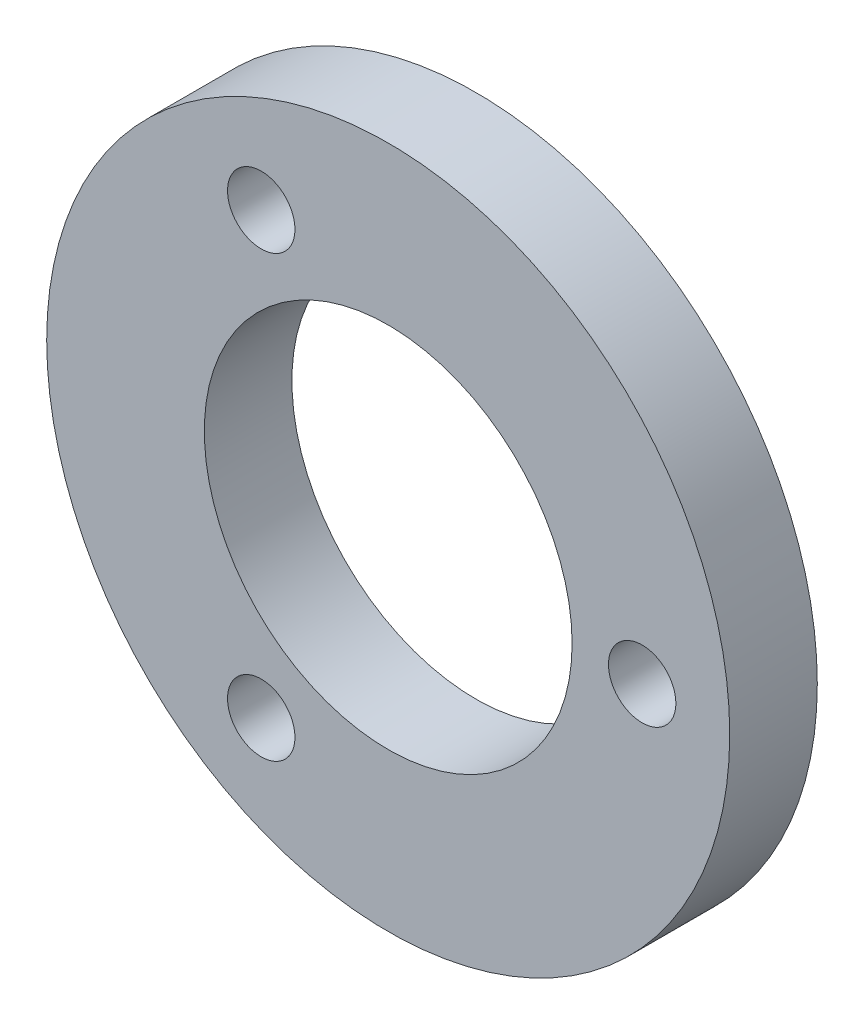
ISO-10303-21;
HEADER;
FILE_DESCRIPTION(('STEP AP214'),'2;1');
FILE_NAME('part.step','',(''),(''),'','','');
FILE_SCHEMA(('AUTOMOTIVE_DESIGN { 1 0 10303 214 1 1 1 1 }'));
ENDSEC;
DATA;
#1=APPLICATION_CONTEXT('core data for automotive mechanical design processes');
#2=APPLICATION_PROTOCOL_DEFINITION('international standard','automotive_design',2000,#1);
#3=PRODUCT_CONTEXT('',#1,'mechanical');
#4=PRODUCT('Part','Part','',(#3));
#5=PRODUCT_RELATED_PRODUCT_CATEGORY('part','',(#4));
#6=PRODUCT_DEFINITION_FORMATION('','',#4);
#7=PRODUCT_DEFINITION_CONTEXT('part definition',#1,'design');
#8=PRODUCT_DEFINITION('design','',#6,#7);
#9=PRODUCT_DEFINITION_SHAPE('','',#8);
#10=(LENGTH_UNIT() NAMED_UNIT(*) SI_UNIT(.MILLI.,.METRE.));
#11=(NAMED_UNIT(*) PLANE_ANGLE_UNIT() SI_UNIT($,.RADIAN.));
#12=(NAMED_UNIT(*) SI_UNIT($,.STERADIAN.) SOLID_ANGLE_UNIT());
#13=UNCERTAINTY_MEASURE_WITH_UNIT(LENGTH_MEASURE(1.E-05),#10,'distance_accuracy_value','');
#14=(GEOMETRIC_REPRESENTATION_CONTEXT(3) GLOBAL_UNCERTAINTY_ASSIGNED_CONTEXT((#13)) GLOBAL_UNIT_ASSIGNED_CONTEXT((#10,
#11,#12)) REPRESENTATION_CONTEXT('',''));
#15=CARTESIAN_POINT('',(0.,0.,0.));
#16=DIRECTION('',(0.,0.,1.));
#17=DIRECTION('',(1.,0.,0.));
#18=AXIS2_PLACEMENT_3D('',#15,#16,#17);
#19=CARTESIAN_POINT('',(0.,0.,5.));
#20=DIRECTION('',(0.,0.,1.));
#21=DIRECTION('',(1.,0.,0.));
#22=AXIS2_PLACEMENT_3D('',#19,#20,#21);
#23=PLANE('',#22);
#24=CARTESIAN_POINT('',(-7.25000000000023,-12.5573683548742,5.));
#25=DIRECTION('',(0.,0.,1.));
#26=DIRECTION('',(1.,0.,0.));
#27=AXIS2_PLACEMENT_3D('',#24,#25,#26);
#28=CIRCLE('',#27,1.92500000000001);
#29=CARTESIAN_POINT('',(-5.32500000000022,-12.5573683548742,5.));
#30=VERTEX_POINT('',#29);
#31=EDGE_CURVE('E52',#30,#30,#28,.T.);
#32=ORIENTED_EDGE('',*,*,#31,.F.);
#33=EDGE_LOOP('',(#32));
#34=FACE_BOUND('',#33,.T.);
#35=CARTESIAN_POINT('',(0.,0.,5.));
#36=DIRECTION('',(0.,0.,1.));
#37=DIRECTION('',(1.,0.,0.));
#38=AXIS2_PLACEMENT_3D('',#35,#36,#37);
#39=CIRCLE('',#38,10.5);
#40=CARTESIAN_POINT('',(10.5,0.,5.));
#41=VERTEX_POINT('',#40);
#42=EDGE_CURVE('E41',#41,#41,#39,.T.);
#43=ORIENTED_EDGE('',*,*,#42,.F.);
#44=EDGE_LOOP('',(#43));
#45=FACE_BOUND('',#44,.T.);
#46=CARTESIAN_POINT('',(0.,0.,5.));
#47=DIRECTION('',(0.,0.,1.));
#48=DIRECTION('',(1.,0.,0.));
#49=AXIS2_PLACEMENT_3D('',#46,#47,#48);
#50=CIRCLE('',#49,19.5);
#51=CARTESIAN_POINT('',(19.5,0.,5.));
#52=VERTEX_POINT('',#51);
#53=EDGE_CURVE('E10',#52,#52,#50,.T.);
#54=ORIENTED_EDGE('',*,*,#53,.T.);
#55=EDGE_LOOP('',(#54));
#56=FACE_BOUND('',#55,.T.);
#57=CARTESIAN_POINT('',(14.5,-2.22044604925031E-13,5.));
#58=DIRECTION('',(0.,0.,1.));
#59=DIRECTION('',(1.,0.,0.));
#60=AXIS2_PLACEMENT_3D('',#57,#58,#59);
#61=CIRCLE('',#60,1.92500000000001);
#62=CARTESIAN_POINT('',(16.425,-2.22044604925031E-13,5.));
#63=VERTEX_POINT('',#62);
#64=EDGE_CURVE('E46',#63,#63,#61,.T.);
#65=ORIENTED_EDGE('',*,*,#64,.F.);
#66=EDGE_LOOP('',(#65));
#67=FACE_BOUND('',#66,.T.);
#68=CARTESIAN_POINT('',(-7.24999999999999,12.5573683548743,5.));
#69=DIRECTION('',(0.,0.,1.));
#70=DIRECTION('',(1.,0.,0.));
#71=AXIS2_PLACEMENT_3D('',#68,#69,#70);
#72=CIRCLE('',#71,1.92500000000001);
#73=CARTESIAN_POINT('',(-5.32499999999998,12.5573683548743,5.));
#74=VERTEX_POINT('',#73);
#75=EDGE_CURVE('E58',#74,#74,#72,.T.);
#76=ORIENTED_EDGE('',*,*,#75,.F.);
#77=EDGE_LOOP('',(#76));
#78=FACE_BOUND('',#77,.T.);
#79=ADVANCED_FACE('F30',(#34,#45,#56,#67,#78),#23,.T.);
#80=CARTESIAN_POINT('',(0.,0.,0.));
#81=DIRECTION('',(0.,0.,1.));
#82=DIRECTION('',(1.,0.,0.));
#83=AXIS2_PLACEMENT_3D('',#80,#81,#82);
#84=PLANE('',#83);
#85=CARTESIAN_POINT('',(0.,0.,0.));
#86=DIRECTION('',(0.,0.,1.));
#87=DIRECTION('',(1.,0.,0.));
#88=AXIS2_PLACEMENT_3D('',#85,#86,#87);
#89=CIRCLE('',#88,19.5);
#90=CARTESIAN_POINT('',(19.5,0.,0.));
#91=VERTEX_POINT('',#90);
#92=EDGE_CURVE('E34',#91,#91,#89,.T.);
#93=ORIENTED_EDGE('',*,*,#92,.F.);
#94=EDGE_LOOP('',(#93));
#95=FACE_BOUND('',#94,.T.);
#96=CARTESIAN_POINT('',(0.,0.,0.));
#97=DIRECTION('',(0.,0.,1.));
#98=DIRECTION('',(1.,0.,0.));
#99=AXIS2_PLACEMENT_3D('',#96,#97,#98);
#100=CIRCLE('',#99,10.5);
#101=CARTESIAN_POINT('',(10.5,0.,0.));
#102=VERTEX_POINT('',#101);
#103=EDGE_CURVE('E43',#102,#102,#100,.T.);
#104=ORIENTED_EDGE('',*,*,#103,.T.);
#105=EDGE_LOOP('',(#104));
#106=FACE_BOUND('',#105,.T.);
#107=CARTESIAN_POINT('',(14.5,-2.22044604925031E-13,0.));
#108=DIRECTION('',(0.,0.,1.));
#109=DIRECTION('',(1.,0.,0.));
#110=AXIS2_PLACEMENT_3D('',#107,#108,#109);
#111=CIRCLE('',#110,1.92500000000001);
#112=CARTESIAN_POINT('',(16.425,-2.22044604925031E-13,0.));
#113=VERTEX_POINT('',#112);
#114=EDGE_CURVE('E49',#113,#113,#111,.T.);
#115=ORIENTED_EDGE('',*,*,#114,.T.);
#116=EDGE_LOOP('',(#115));
#117=FACE_BOUND('',#116,.T.);
#118=CARTESIAN_POINT('',(-7.25000000000023,-12.5573683548742,0.));
#119=DIRECTION('',(0.,0.,1.));
#120=DIRECTION('',(1.,0.,0.));
#121=AXIS2_PLACEMENT_3D('',#118,#119,#120);
#122=CIRCLE('',#121,1.92500000000001);
#123=CARTESIAN_POINT('',(-5.32500000000022,-12.5573683548742,0.));
#124=VERTEX_POINT('',#123);
#125=EDGE_CURVE('E55',#124,#124,#122,.T.);
#126=ORIENTED_EDGE('',*,*,#125,.T.);
#127=EDGE_LOOP('',(#126));
#128=FACE_BOUND('',#127,.T.);
#129=CARTESIAN_POINT('',(-7.24999999999999,12.5573683548743,0.));
#130=DIRECTION('',(0.,0.,1.));
#131=DIRECTION('',(1.,0.,0.));
#132=AXIS2_PLACEMENT_3D('',#129,#130,#131);
#133=CIRCLE('',#132,1.92500000000001);
#134=CARTESIAN_POINT('',(-5.32499999999998,12.5573683548743,0.));
#135=VERTEX_POINT('',#134);
#136=EDGE_CURVE('E61',#135,#135,#133,.T.);
#137=ORIENTED_EDGE('',*,*,#136,.T.);
#138=EDGE_LOOP('',(#137));
#139=FACE_BOUND('',#138,.T.);
#140=ADVANCED_FACE('F71',(#95,#106,#117,#128,#139),#84,.F.);
#141=CARTESIAN_POINT('',(0.,0.,5.));
#142=DIRECTION('',(0.,0.,-1.));
#143=DIRECTION('',(-1.,0.,0.));
#144=AXIS2_PLACEMENT_3D('',#141,#142,#143);
#145=CYLINDRICAL_SURFACE('',#144,19.5);
#146=ORIENTED_EDGE('',*,*,#53,.F.);
#147=EDGE_LOOP('',(#146));
#148=FACE_BOUND('',#147,.T.);
#149=ORIENTED_EDGE('',*,*,#92,.T.);
#150=EDGE_LOOP('',(#149));
#151=FACE_BOUND('',#150,.T.);
#152=ADVANCED_FACE('F32',(#148,#151),#145,.T.);
#153=CARTESIAN_POINT('',(0.,0.,5.));
#154=DIRECTION('',(0.,0.,-1.));
#155=DIRECTION('',(-1.,0.,0.));
#156=AXIS2_PLACEMENT_3D('',#153,#154,#155);
#157=CYLINDRICAL_SURFACE('',#156,10.5);
#158=ORIENTED_EDGE('',*,*,#42,.T.);
#159=EDGE_LOOP('',(#158));
#160=FACE_BOUND('',#159,.T.);
#161=ORIENTED_EDGE('',*,*,#103,.F.);
#162=EDGE_LOOP('',(#161));
#163=FACE_BOUND('',#162,.T.);
#164=ADVANCED_FACE('F81',(#160,#163),#157,.F.);
#165=CARTESIAN_POINT('',(14.5,-2.22044604925031E-13,5.));
#166=DIRECTION('',(0.,0.,-1.));
#167=DIRECTION('',(-1.,0.,0.));
#168=AXIS2_PLACEMENT_3D('',#165,#166,#167);
#169=CYLINDRICAL_SURFACE('',#168,1.92500000000001);
#170=ORIENTED_EDGE('',*,*,#64,.T.);
#171=EDGE_LOOP('',(#170));
#172=FACE_BOUND('',#171,.T.);
#173=ORIENTED_EDGE('',*,*,#114,.F.);
#174=EDGE_LOOP('',(#173));
#175=FACE_BOUND('',#174,.T.);
#176=ADVANCED_FACE('F84',(#172,#175),#169,.F.);
#177=CARTESIAN_POINT('',(-7.25000000000023,-12.5573683548742,5.));
#178=DIRECTION('',(0.,0.,-1.));
#179=DIRECTION('',(-1.,0.,0.));
#180=AXIS2_PLACEMENT_3D('',#177,#178,#179);
#181=CYLINDRICAL_SURFACE('',#180,1.92500000000001);
#182=ORIENTED_EDGE('',*,*,#31,.T.);
#183=EDGE_LOOP('',(#182));
#184=FACE_BOUND('',#183,.T.);
#185=ORIENTED_EDGE('',*,*,#125,.F.);
#186=EDGE_LOOP('',(#185));
#187=FACE_BOUND('',#186,.T.);
#188=ADVANCED_FACE('F88',(#184,#187),#181,.F.);
#189=CARTESIAN_POINT('',(-7.24999999999999,12.5573683548743,5.));
#190=DIRECTION('',(0.,0.,-1.));
#191=DIRECTION('',(-1.,0.,0.));
#192=AXIS2_PLACEMENT_3D('',#189,#190,#191);
#193=CYLINDRICAL_SURFACE('',#192,1.92500000000001);
#194=ORIENTED_EDGE('',*,*,#75,.T.);
#195=EDGE_LOOP('',(#194));
#196=FACE_BOUND('',#195,.T.);
#197=ORIENTED_EDGE('',*,*,#136,.F.);
#198=EDGE_LOOP('',(#197));
#199=FACE_BOUND('',#198,.T.);
#200=ADVANCED_FACE('F67',(#196,#199),#193,.F.);
#201=CLOSED_SHELL('',(#79,#140,#152,#164,#176,#188,#200));
#202=MANIFOLD_SOLID_BREP('B2',#201);
#203=ADVANCED_BREP_SHAPE_REPRESENTATION('',(#18,#202),#14);
#204=SHAPE_DEFINITION_REPRESENTATION(#9,#203);
ENDSEC;
END-ISO-10303-21;
